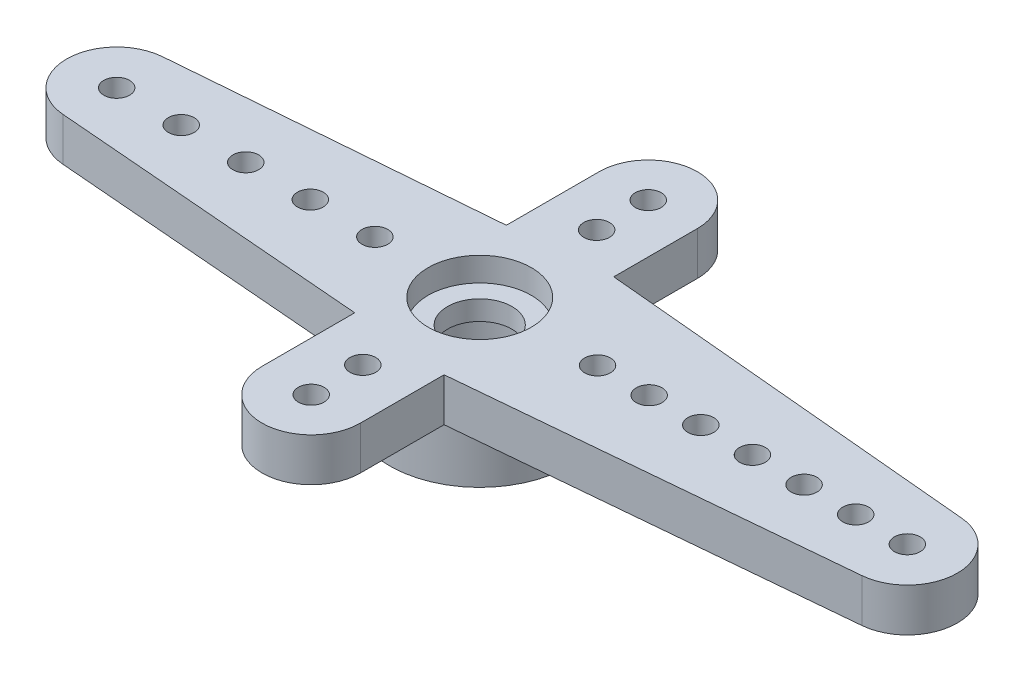
ISO-10303-21;
HEADER;
FILE_DESCRIPTION(('STEP AP214'),'2;1');
FILE_NAME('part.step','',(''),(''),'','','');
FILE_SCHEMA(('AUTOMOTIVE_DESIGN { 1 0 10303 214 1 1 1 1 }'));
ENDSEC;
DATA;
#1=APPLICATION_CONTEXT('core data for automotive mechanical design processes');
#2=APPLICATION_PROTOCOL_DEFINITION('international standard','automotive_design',2000,#1);
#3=PRODUCT_CONTEXT('',#1,'mechanical');
#4=PRODUCT('Part','Part','',(#3));
#5=PRODUCT_RELATED_PRODUCT_CATEGORY('part','',(#4));
#6=PRODUCT_DEFINITION_FORMATION('','',#4);
#7=PRODUCT_DEFINITION_CONTEXT('part definition',#1,'design');
#8=PRODUCT_DEFINITION('design','',#6,#7);
#9=PRODUCT_DEFINITION_SHAPE('','',#8);
#10=(LENGTH_UNIT() NAMED_UNIT(*) SI_UNIT(.MILLI.,.METRE.));
#11=(NAMED_UNIT(*) PLANE_ANGLE_UNIT() SI_UNIT($,.RADIAN.));
#12=(NAMED_UNIT(*) SI_UNIT($,.STERADIAN.) SOLID_ANGLE_UNIT());
#13=UNCERTAINTY_MEASURE_WITH_UNIT(LENGTH_MEASURE(1.E-05),#10,'distance_accuracy_value','');
#14=(GEOMETRIC_REPRESENTATION_CONTEXT(3) GLOBAL_UNCERTAINTY_ASSIGNED_CONTEXT((#13)) GLOBAL_UNIT_ASSIGNED_CONTEXT((#10,
#11,#12)) REPRESENTATION_CONTEXT('',''));
#15=CARTESIAN_POINT('',(0.,0.,0.));
#16=DIRECTION('',(0.,0.,1.));
#17=DIRECTION('',(1.,0.,0.));
#18=AXIS2_PLACEMENT_3D('',#15,#16,#17);
#19=CARTESIAN_POINT('',(0.,0.,0.));
#20=DIRECTION('',(0.,1.,0.));
#21=DIRECTION('',(-1.,0.,0.));
#22=AXIS2_PLACEMENT_3D('',#19,#20,#21);
#23=CYLINDRICAL_SURFACE('',#22,3.5);
#24=CARTESIAN_POINT('',(0.,-2.21,0.));
#25=DIRECTION('',(0.,1.,0.));
#26=DIRECTION('',(-1.,0.,0.));
#27=AXIS2_PLACEMENT_3D('',#24,#25,#26);
#28=CIRCLE('',#27,3.5);
#29=CARTESIAN_POINT('',(-3.5,-2.21,0.));
#30=VERTEX_POINT('',#29);
#31=EDGE_CURVE('E41',#30,#30,#28,.T.);
#32=ORIENTED_EDGE('',*,*,#31,.T.);
#33=EDGE_LOOP('',(#32));
#34=FACE_BOUND('',#33,.T.);
#35=CARTESIAN_POINT('',(0.,0.0149999999999994,0.));
#36=DIRECTION('',(0.,-1.,0.));
#37=DIRECTION('',(1.,0.,0.));
#38=AXIS2_PLACEMENT_3D('',#35,#36,#37);
#39=CIRCLE('',#38,3.5);
#40=CARTESIAN_POINT('',(-1.905,0.0149999999999992,-2.93614968964459));
#41=VERTEX_POINT('',#40);
#42=CARTESIAN_POINT('',(-1.905,0.0149999999999992,2.93614968964459));
#43=VERTEX_POINT('',#42);
#44=EDGE_CURVE('E290',#41,#43,#39,.T.);
#45=ORIENTED_EDGE('',*,*,#44,.T.);
#46=CARTESIAN_POINT('',(0.,0.0149999999999994,0.));
#47=DIRECTION('',(0.,1.,0.));
#48=DIRECTION('',(1.,0.,0.));
#49=AXIS2_PLACEMENT_3D('',#46,#47,#48);
#50=CIRCLE('',#49,3.5);
#51=EDGE_CURVE('E156',#41,#43,#50,.T.);
#52=ORIENTED_EDGE('',*,*,#51,.F.);
#53=EDGE_LOOP('',(#45,#52));
#54=FACE_BOUND('',#53,.T.);
#55=ADVANCED_FACE('F33',(#34,#54),#23,.T.);
#56=CARTESIAN_POINT('',(0.,0.,0.));
#57=DIRECTION('',(0.,1.,0.));
#58=DIRECTION('',(-1.,0.,0.));
#59=AXIS2_PLACEMENT_3D('',#56,#57,#58);
#60=CYLINDRICAL_SURFACE('',#59,2.25);
#61=CARTESIAN_POINT('',(0.,-2.21,0.));
#62=DIRECTION('',(0.,1.,0.));
#63=DIRECTION('',(-1.,0.,0.));
#64=AXIS2_PLACEMENT_3D('',#61,#62,#63);
#65=CIRCLE('',#64,2.25);
#66=CARTESIAN_POINT('',(-2.25,-2.21,0.));
#67=VERTEX_POINT('',#66);
#68=EDGE_CURVE('E11',#67,#67,#65,.T.);
#69=ORIENTED_EDGE('',*,*,#68,.F.);
#70=EDGE_LOOP('',(#69));
#71=FACE_BOUND('',#70,.T.);
#72=CARTESIAN_POINT('',(0.,0.,0.));
#73=DIRECTION('',(0.,1.,0.));
#74=DIRECTION('',(-1.,0.,0.));
#75=AXIS2_PLACEMENT_3D('',#72,#73,#74);
#76=CIRCLE('',#75,2.25);
#77=CARTESIAN_POINT('',(-2.25,0.,0.));
#78=VERTEX_POINT('',#77);
#79=EDGE_CURVE('E298',#78,#78,#76,.T.);
#80=ORIENTED_EDGE('',*,*,#79,.T.);
#81=EDGE_LOOP('',(#80));
#82=FACE_BOUND('',#81,.T.);
#83=ADVANCED_FACE('F35',(#71,#82),#60,.F.);
#84=CARTESIAN_POINT('',(3.5,-2.21,0.));
#85=DIRECTION('',(0.,1.,0.));
#86=DIRECTION('',(-1.,0.,0.));
#87=AXIS2_PLACEMENT_3D('',#84,#85,#86);
#88=PLANE('',#87);
#89=ORIENTED_EDGE('',*,*,#31,.F.);
#90=EDGE_LOOP('',(#89));
#91=FACE_BOUND('',#90,.T.);
#92=ORIENTED_EDGE('',*,*,#68,.T.);
#93=EDGE_LOOP('',(#92));
#94=FACE_BOUND('',#93,.T.);
#95=ADVANCED_FACE('F320',(#91,#94),#88,.F.);
#96=CARTESIAN_POINT('',(2.,1.69,0.));
#97=DIRECTION('',(0.,-1.,0.));
#98=DIRECTION('',(1.,0.,0.));
#99=AXIS2_PLACEMENT_3D('',#96,#97,#98);
#100=PLANE('',#99);
#101=DIRECTION('',(-0.995847060416603,0.,-0.0910419258342595));
#102=VECTOR('',#101,1.);
#103=CARTESIAN_POINT('',(0.927024810886958,1.69,-3.375));
#104=LINE('',#103,#102);
#105=CARTESIAN_POINT('',(16.7388936749485,1.69,-1.92945374129969));
#106=VERTEX_POINT('',#105);
#107=CARTESIAN_POINT('',(1.905,1.69,-3.2855919491315));
#108=VERTEX_POINT('',#107);
#109=EDGE_CURVE('E187',#106,#108,#104,.T.);
#110=ORIENTED_EDGE('',*,*,#109,.T.);
#111=DIRECTION('',(0.,0.,-1.));
#112=VECTOR('',#111,1.);
#113=CARTESIAN_POINT('',(1.905,1.69,-6.5278));
#114=LINE('',#113,#112);
#115=CARTESIAN_POINT('',(1.905,1.69,-6.5278));
#116=VERTEX_POINT('',#115);
#117=EDGE_CURVE('E71',#108,#116,#114,.T.);
#118=ORIENTED_EDGE('',*,*,#117,.T.);
#119=CARTESIAN_POINT('',(0.,1.69,-6.5278));
#120=DIRECTION('',(0.,1.,0.));
#121=DIRECTION('',(1.,0.,0.));
#122=AXIS2_PLACEMENT_3D('',#119,#120,#121);
#123=CIRCLE('',#122,1.905);
#124=CARTESIAN_POINT('',(-1.905,1.69,-6.5278));
#125=VERTEX_POINT('',#124);
#126=EDGE_CURVE('E282',#116,#125,#123,.T.);
#127=ORIENTED_EDGE('',*,*,#126,.T.);
#128=DIRECTION('',(0.,0.,1.));
#129=VECTOR('',#128,1.);
#130=CARTESIAN_POINT('',(-1.905,1.69,-6.5278));
#131=LINE('',#130,#129);
#132=CARTESIAN_POINT('',(-1.905,1.69,-2.93614968964459));
#133=VERTEX_POINT('',#132);
#134=EDGE_CURVE('E48',#125,#133,#131,.T.);
#135=ORIENTED_EDGE('',*,*,#134,.T.);
#136=DIRECTION('',(-0.996686218770202,0.,0.0813423709610028));
#137=VECTOR('',#136,1.);
#138=CARTESIAN_POINT('',(-14.2201007867802,1.69,-1.93107961066181));
#139=LINE('',#138,#137);
#140=CARTESIAN_POINT('',(-14.2201007867802,1.69,-1.93107961066181));
#141=VERTEX_POINT('',#140);
#142=EDGE_CURVE('E386',#133,#141,#139,.T.);
#143=ORIENTED_EDGE('',*,*,#142,.T.);
#144=CARTESIAN_POINT('',(-14.062499938,1.69,0.));
#145=DIRECTION('',(0.,-1.,0.));
#146=DIRECTION('',(1.,0.,0.));
#147=AXIS2_PLACEMENT_3D('',#144,#145,#146);
#148=CIRCLE('',#147,1.937500062);
#149=CARTESIAN_POINT('',(-14.2201007867802,1.69,1.93107961066181));
#150=VERTEX_POINT('',#149);
#151=EDGE_CURVE('E163',#141,#150,#148,.F.);
#152=ORIENTED_EDGE('',*,*,#151,.T.);
#153=DIRECTION('',(0.996686218770202,0.,0.0813423709610028));
#154=VECTOR('',#153,1.);
#155=CARTESIAN_POINT('',(-1.905,1.69,2.93614968964459));
#156=LINE('',#155,#154);
#157=CARTESIAN_POINT('',(-1.905,1.69,2.93614968964459));
#158=VERTEX_POINT('',#157);
#159=EDGE_CURVE('E141',#150,#158,#156,.T.);
#160=ORIENTED_EDGE('',*,*,#159,.T.);
#161=DIRECTION('',(0.,0.,1.));
#162=VECTOR('',#161,1.);
#163=CARTESIAN_POINT('',(-1.905,1.69,6.5278));
#164=LINE('',#163,#162);
#165=CARTESIAN_POINT('',(-1.905,1.69,6.5278));
#166=VERTEX_POINT('',#165);
#167=EDGE_CURVE('E253',#158,#166,#164,.T.);
#168=ORIENTED_EDGE('',*,*,#167,.T.);
#169=CARTESIAN_POINT('',(0.,1.69,6.5278));
#170=DIRECTION('',(0.,1.,0.));
#171=DIRECTION('',(-1.,0.,0.));
#172=AXIS2_PLACEMENT_3D('',#169,#170,#171);
#173=CIRCLE('',#172,1.905);
#174=CARTESIAN_POINT('',(1.905,1.69,6.5278));
#175=VERTEX_POINT('',#174);
#176=EDGE_CURVE('E246',#166,#175,#173,.T.);
#177=ORIENTED_EDGE('',*,*,#176,.T.);
#178=DIRECTION('',(0.,0.,-1.));
#179=VECTOR('',#178,1.);
#180=CARTESIAN_POINT('',(1.905,1.69,6.5278));
#181=LINE('',#180,#179);
#182=CARTESIAN_POINT('',(1.905,1.69,3.2855919491315));
#183=VERTEX_POINT('',#182);
#184=EDGE_CURVE('E262',#175,#183,#181,.T.);
#185=ORIENTED_EDGE('',*,*,#184,.T.);
#186=DIRECTION('',(0.995847060416603,0.,-0.0910419258342595));
#187=VECTOR('',#186,1.);
#188=CARTESIAN_POINT('',(0.927024810886958,1.69,3.375));
#189=LINE('',#188,#187);
#190=CARTESIAN_POINT('',(16.7388936749485,1.69,1.92945374129969));
#191=VERTEX_POINT('',#190);
#192=EDGE_CURVE('E192',#183,#191,#189,.T.);
#193=ORIENTED_EDGE('',*,*,#192,.T.);
#194=CARTESIAN_POINT('',(16.562499938,1.69,0.));
#195=DIRECTION('',(0.,-1.,0.));
#196=DIRECTION('',(1.,0.,0.));
#197=AXIS2_PLACEMENT_3D('',#194,#195,#196);
#198=CIRCLE('',#197,1.937500062);
#199=EDGE_CURVE('E193',#191,#106,#198,.F.);
#200=ORIENTED_EDGE('',*,*,#199,.T.);
#201=EDGE_LOOP('',(#110,#118,#127,#135,#143,#152,#160,#168,#177,#185,#193,#200));
#202=FACE_BOUND('',#201,.T.);
#203=CARTESIAN_POINT('',(14.562499938,1.69,0.));
#204=DIRECTION('',(0.,-1.,0.));
#205=DIRECTION('',(1.,0.,0.));
#206=AXIS2_PLACEMENT_3D('',#203,#204,#205);
#207=CIRCLE('',#206,0.499999999999999);
#208=CARTESIAN_POINT('',(15.062499938,1.69,0.));
#209=VERTEX_POINT('',#208);
#210=EDGE_CURVE('E181',#209,#209,#207,.F.);
#211=ORIENTED_EDGE('',*,*,#210,.F.);
#212=EDGE_LOOP('',(#211));
#213=FACE_BOUND('',#212,.T.);
#214=CARTESIAN_POINT('',(10.562499938,1.69,0.));
#215=DIRECTION('',(0.,-1.,0.));
#216=DIRECTION('',(1.,0.,0.));
#217=AXIS2_PLACEMENT_3D('',#214,#215,#216);
#218=CIRCLE('',#217,0.499999999999999);
#219=CARTESIAN_POINT('',(11.062499938,1.69,0.));
#220=VERTEX_POINT('',#219);
#221=EDGE_CURVE('E174',#220,#220,#218,.F.);
#222=ORIENTED_EDGE('',*,*,#221,.F.);
#223=EDGE_LOOP('',(#222));
#224=FACE_BOUND('',#223,.T.);
#225=CARTESIAN_POINT('',(6.562499938,1.69,0.));
#226=DIRECTION('',(0.,-1.,0.));
#227=DIRECTION('',(1.,0.,0.));
#228=AXIS2_PLACEMENT_3D('',#225,#226,#227);
#229=CIRCLE('',#228,0.499999999999999);
#230=CARTESIAN_POINT('',(7.062499938,1.69,0.));
#231=VERTEX_POINT('',#230);
#232=EDGE_CURVE('E170',#231,#231,#229,.F.);
#233=ORIENTED_EDGE('',*,*,#232,.F.);
#234=EDGE_LOOP('',(#233));
#235=FACE_BOUND('',#234,.T.);
#236=CARTESIAN_POINT('',(4.562499938,1.69,0.));
#237=DIRECTION('',(0.,-1.,0.));
#238=DIRECTION('',(1.,0.,0.));
#239=AXIS2_PLACEMENT_3D('',#236,#237,#238);
#240=CIRCLE('',#239,0.499999999999999);
#241=CARTESIAN_POINT('',(5.062499938,1.69,0.));
#242=VERTEX_POINT('',#241);
#243=EDGE_CURVE('E173',#242,#242,#240,.F.);
#244=ORIENTED_EDGE('',*,*,#243,.F.);
#245=EDGE_LOOP('',(#244));
#246=FACE_BOUND('',#245,.T.);
#247=CARTESIAN_POINT('',(8.562499938,1.69,0.));
#248=DIRECTION('',(0.,-1.,0.));
#249=DIRECTION('',(1.,0.,0.));
#250=AXIS2_PLACEMENT_3D('',#247,#248,#249);
#251=CIRCLE('',#250,0.499999999999999);
#252=CARTESIAN_POINT('',(9.062499938,1.69,0.));
#253=VERTEX_POINT('',#252);
#254=EDGE_CURVE('E175',#253,#253,#251,.F.);
#255=ORIENTED_EDGE('',*,*,#254,.F.);
#256=EDGE_LOOP('',(#255));
#257=FACE_BOUND('',#256,.T.);
#258=CARTESIAN_POINT('',(12.562499938,1.69,0.));
#259=DIRECTION('',(0.,-1.,0.));
#260=DIRECTION('',(1.,0.,0.));
#261=AXIS2_PLACEMENT_3D('',#258,#259,#260);
#262=CIRCLE('',#261,0.499999999999999);
#263=CARTESIAN_POINT('',(13.062499938,1.69,0.));
#264=VERTEX_POINT('',#263);
#265=EDGE_CURVE('E178',#264,#264,#262,.F.);
#266=ORIENTED_EDGE('',*,*,#265,.F.);
#267=EDGE_LOOP('',(#266));
#268=FACE_BOUND('',#267,.T.);
#269=CARTESIAN_POINT('',(16.562499938,1.69,0.));
#270=DIRECTION('',(0.,-1.,0.));
#271=DIRECTION('',(1.,0.,0.));
#272=AXIS2_PLACEMENT_3D('',#269,#270,#271);
#273=CIRCLE('',#272,0.499999999999999);
#274=CARTESIAN_POINT('',(17.062499938,1.69,0.));
#275=VERTEX_POINT('',#274);
#276=EDGE_CURVE('E184',#275,#275,#273,.F.);
#277=ORIENTED_EDGE('',*,*,#276,.F.);
#278=EDGE_LOOP('',(#277));
#279=FACE_BOUND('',#278,.T.);
#280=CARTESIAN_POINT('',(0.,1.69,0.));
#281=DIRECTION('',(0.,1.,0.));
#282=DIRECTION('',(-1.,0.,0.));
#283=AXIS2_PLACEMENT_3D('',#280,#281,#282);
#284=CIRCLE('',#283,2.);
#285=CARTESIAN_POINT('',(-2.,1.69,0.));
#286=VERTEX_POINT('',#285);
#287=EDGE_CURVE('E313',#286,#286,#284,.T.);
#288=ORIENTED_EDGE('',*,*,#287,.F.);
#289=EDGE_LOOP('',(#288));
#290=FACE_BOUND('',#289,.T.);
#291=CARTESIAN_POINT('',(0.,1.69,-4.5278));
#292=DIRECTION('',(0.,1.,0.));
#293=DIRECTION('',(-1.,0.,0.));
#294=AXIS2_PLACEMENT_3D('',#291,#292,#293);
#295=CIRCLE('',#294,0.5);
#296=CARTESIAN_POINT('',(-0.5,1.69,-4.5278));
#297=VERTEX_POINT('',#296);
#298=EDGE_CURVE('E269',#297,#297,#295,.T.);
#299=ORIENTED_EDGE('',*,*,#298,.F.);
#300=EDGE_LOOP('',(#299));
#301=FACE_BOUND('',#300,.T.);
#302=CARTESIAN_POINT('',(0.,1.69,-6.5278));
#303=DIRECTION('',(0.,1.,0.));
#304=DIRECTION('',(-1.,0.,0.));
#305=AXIS2_PLACEMENT_3D('',#302,#303,#304);
#306=CIRCLE('',#305,0.5);
#307=CARTESIAN_POINT('',(-0.500000000000001,1.69,-6.5278));
#308=VERTEX_POINT('',#307);
#309=EDGE_CURVE('E276',#308,#308,#306,.T.);
#310=ORIENTED_EDGE('',*,*,#309,.F.);
#311=EDGE_LOOP('',(#310));
#312=FACE_BOUND('',#311,.T.);
#313=CARTESIAN_POINT('',(0.,1.69,4.5278));
#314=DIRECTION('',(0.,1.,0.));
#315=DIRECTION('',(1.,0.,0.));
#316=AXIS2_PLACEMENT_3D('',#313,#314,#315);
#317=CIRCLE('',#316,0.5);
#318=CARTESIAN_POINT('',(0.5,1.69,4.5278));
#319=VERTEX_POINT('',#318);
#320=EDGE_CURVE('E236',#319,#319,#317,.T.);
#321=ORIENTED_EDGE('',*,*,#320,.F.);
#322=EDGE_LOOP('',(#321));
#323=FACE_BOUND('',#322,.T.);
#324=CARTESIAN_POINT('',(0.,1.69,6.5278));
#325=DIRECTION('',(0.,1.,0.));
#326=DIRECTION('',(1.,0.,0.));
#327=AXIS2_PLACEMENT_3D('',#324,#325,#326);
#328=CIRCLE('',#327,0.5);
#329=CARTESIAN_POINT('',(0.500000000000001,1.69,6.5278));
#330=VERTEX_POINT('',#329);
#331=EDGE_CURVE('E240',#330,#330,#328,.T.);
#332=ORIENTED_EDGE('',*,*,#331,.F.);
#333=EDGE_LOOP('',(#332));
#334=FACE_BOUND('',#333,.T.);
#335=CARTESIAN_POINT('',(-11.562499938,1.69,0.));
#336=DIRECTION('',(0.,-1.,0.));
#337=DIRECTION('',(1.,0.,0.));
#338=AXIS2_PLACEMENT_3D('',#335,#336,#337);
#339=CIRCLE('',#338,0.499999999999999);
#340=CARTESIAN_POINT('',(-11.062499938,1.69,0.));
#341=VERTEX_POINT('',#340);
#342=EDGE_CURVE('E369',#341,#341,#339,.F.);
#343=ORIENTED_EDGE('',*,*,#342,.F.);
#344=EDGE_LOOP('',(#343));
#345=FACE_BOUND('',#344,.T.);
#346=CARTESIAN_POINT('',(-6.562499938,1.69,0.));
#347=DIRECTION('',(0.,-1.,0.));
#348=DIRECTION('',(1.,0.,0.));
#349=AXIS2_PLACEMENT_3D('',#346,#347,#348);
#350=CIRCLE('',#349,0.499999999999999);
#351=CARTESIAN_POINT('',(-6.062499938,1.69,0.));
#352=VERTEX_POINT('',#351);
#353=EDGE_CURVE('E169',#352,#352,#350,.F.);
#354=ORIENTED_EDGE('',*,*,#353,.F.);
#355=EDGE_LOOP('',(#354));
#356=FACE_BOUND('',#355,.T.);
#357=CARTESIAN_POINT('',(-4.062499938,1.69,0.));
#358=DIRECTION('',(0.,-1.,0.));
#359=DIRECTION('',(1.,0.,0.));
#360=AXIS2_PLACEMENT_3D('',#357,#358,#359);
#361=CIRCLE('',#360,0.499999999999999);
#362=CARTESIAN_POINT('',(-3.562499938,1.69,0.));
#363=VERTEX_POINT('',#362);
#364=EDGE_CURVE('E165',#363,#363,#361,.F.);
#365=ORIENTED_EDGE('',*,*,#364,.F.);
#366=EDGE_LOOP('',(#365));
#367=FACE_BOUND('',#366,.T.);
#368=CARTESIAN_POINT('',(-9.062499938,1.69,0.));
#369=DIRECTION('',(0.,-1.,0.));
#370=DIRECTION('',(1.,0.,0.));
#371=AXIS2_PLACEMENT_3D('',#368,#369,#370);
#372=CIRCLE('',#371,0.499999999999999);
#373=CARTESIAN_POINT('',(-8.562499938,1.69,0.));
#374=VERTEX_POINT('',#373);
#375=EDGE_CURVE('E168',#374,#374,#372,.F.);
#376=ORIENTED_EDGE('',*,*,#375,.F.);
#377=EDGE_LOOP('',(#376));
#378=FACE_BOUND('',#377,.T.);
#379=CARTESIAN_POINT('',(-14.062499938,1.69,0.));
#380=DIRECTION('',(0.,-1.,0.));
#381=DIRECTION('',(1.,0.,0.));
#382=AXIS2_PLACEMENT_3D('',#379,#380,#381);
#383=CIRCLE('',#382,0.499999999999999);
#384=CARTESIAN_POINT('',(-13.562499938,1.69,0.));
#385=VERTEX_POINT('',#384);
#386=EDGE_CURVE('E201',#385,#385,#383,.F.);
#387=ORIENTED_EDGE('',*,*,#386,.F.);
#388=EDGE_LOOP('',(#387));
#389=FACE_BOUND('',#388,.T.);
#390=ADVANCED_FACE('F323',(#202,#213,#224,#235,#246,#257,#268,#279,#290,#301,#312,#323,#334,
#345,#356,#367,#378,#389),#100,.F.);
#391=CARTESIAN_POINT('',(0.,0.,0.));
#392=DIRECTION('',(0.,1.,0.));
#393=DIRECTION('',(-1.,0.,0.));
#394=AXIS2_PLACEMENT_3D('',#391,#392,#393);
#395=CYLINDRICAL_SURFACE('',#394,2.);
#396=CARTESIAN_POINT('',(0.,0.759999999999999,0.));
#397=DIRECTION('',(0.,1.,0.));
#398=DIRECTION('',(-1.,0.,0.));
#399=AXIS2_PLACEMENT_3D('',#396,#397,#398);
#400=CIRCLE('',#399,2.);
#401=CARTESIAN_POINT('',(-2.,0.759999999999999,0.));
#402=VERTEX_POINT('',#401);
#403=EDGE_CURVE('E310',#402,#402,#400,.T.);
#404=ORIENTED_EDGE('',*,*,#403,.F.);
#405=EDGE_LOOP('',(#404));
#406=FACE_BOUND('',#405,.T.);
#407=ORIENTED_EDGE('',*,*,#287,.T.);
#408=EDGE_LOOP('',(#407));
#409=FACE_BOUND('',#408,.T.);
#410=ADVANCED_FACE('F346',(#406,#409),#395,.F.);
#411=CARTESIAN_POINT('',(1.25,0.76,0.));
#412=DIRECTION('',(0.,-1.,0.));
#413=DIRECTION('',(1.,0.,0.));
#414=AXIS2_PLACEMENT_3D('',#411,#412,#413);
#415=PLANE('',#414);
#416=CARTESIAN_POINT('',(0.,0.759999999999999,0.));
#417=DIRECTION('',(0.,1.,0.));
#418=DIRECTION('',(-1.,0.,0.));
#419=AXIS2_PLACEMENT_3D('',#416,#417,#418);
#420=CIRCLE('',#419,1.25);
#421=CARTESIAN_POINT('',(-1.25,0.759999999999999,0.));
#422=VERTEX_POINT('',#421);
#423=EDGE_CURVE('E307',#422,#422,#420,.T.);
#424=ORIENTED_EDGE('',*,*,#423,.F.);
#425=EDGE_LOOP('',(#424));
#426=FACE_BOUND('',#425,.T.);
#427=ORIENTED_EDGE('',*,*,#403,.T.);
#428=EDGE_LOOP('',(#427));
#429=FACE_BOUND('',#428,.T.);
#430=ADVANCED_FACE('F340',(#426,#429),#415,.F.);
#431=CARTESIAN_POINT('',(0.,0.,0.));
#432=DIRECTION('',(0.,1.,0.));
#433=DIRECTION('',(-1.,0.,0.));
#434=AXIS2_PLACEMENT_3D('',#431,#432,#433);
#435=CYLINDRICAL_SURFACE('',#434,1.25);
#436=CARTESIAN_POINT('',(0.,0.,0.));
#437=DIRECTION('',(0.,1.,0.));
#438=DIRECTION('',(-1.,0.,0.));
#439=AXIS2_PLACEMENT_3D('',#436,#437,#438);
#440=CIRCLE('',#439,1.25);
#441=CARTESIAN_POINT('',(-1.25,0.,0.));
#442=VERTEX_POINT('',#441);
#443=EDGE_CURVE('E304',#442,#442,#440,.T.);
#444=ORIENTED_EDGE('',*,*,#443,.F.);
#445=EDGE_LOOP('',(#444));
#446=FACE_BOUND('',#445,.T.);
#447=ORIENTED_EDGE('',*,*,#423,.T.);
#448=EDGE_LOOP('',(#447));
#449=FACE_BOUND('',#448,.T.);
#450=ADVANCED_FACE('F334',(#446,#449),#435,.F.);
#451=CARTESIAN_POINT('',(2.25,0.,0.));
#452=DIRECTION('',(0.,1.,0.));
#453=DIRECTION('',(-1.,0.,0.));
#454=AXIS2_PLACEMENT_3D('',#451,#452,#453);
#455=PLANE('',#454);
#456=ORIENTED_EDGE('',*,*,#79,.F.);
#457=EDGE_LOOP('',(#456));
#458=FACE_BOUND('',#457,.T.);
#459=ORIENTED_EDGE('',*,*,#443,.T.);
#460=EDGE_LOOP('',(#459));
#461=FACE_BOUND('',#460,.T.);
#462=ADVANCED_FACE('F330',(#458,#461),#455,.F.);
#463=CARTESIAN_POINT('',(0.,0.0149999999999994,-6.5278));
#464=DIRECTION('',(0.,1.,0.));
#465=DIRECTION('',(-1.,0.,0.));
#466=AXIS2_PLACEMENT_3D('',#463,#464,#465);
#467=CYLINDRICAL_SURFACE('',#466,1.905);
#468=ORIENTED_EDGE('',*,*,#126,.F.);
#469=DIRECTION('',(0.,1.,0.));
#470=VECTOR('',#469,1.);
#471=CARTESIAN_POINT('',(1.905,0.0149999999999996,-6.5278));
#472=LINE('',#471,#470);
#473=CARTESIAN_POINT('',(1.905,0.0149999999999996,-6.5278));
#474=VERTEX_POINT('',#473);
#475=EDGE_CURVE('E296',#474,#116,#472,.T.);
#476=ORIENTED_EDGE('',*,*,#475,.F.);
#477=CARTESIAN_POINT('',(0.,0.0149999999999994,-6.5278));
#478=DIRECTION('',(0.,1.,0.));
#479=DIRECTION('',(1.,0.,0.));
#480=AXIS2_PLACEMENT_3D('',#477,#478,#479);
#481=CIRCLE('',#480,1.905);
#482=CARTESIAN_POINT('',(-1.905,0.0149999999999992,-6.5278));
#483=VERTEX_POINT('',#482);
#484=EDGE_CURVE('E285',#474,#483,#481,.T.);
#485=ORIENTED_EDGE('',*,*,#484,.T.);
#486=DIRECTION('',(0.,1.,0.));
#487=VECTOR('',#486,1.);
#488=CARTESIAN_POINT('',(-1.905,0.0149999999999992,-6.5278));
#489=LINE('',#488,#487);
#490=EDGE_CURVE('E75',#483,#125,#489,.T.);
#491=ORIENTED_EDGE('',*,*,#490,.T.);
#492=EDGE_LOOP('',(#468,#476,#485,#491));
#493=FACE_BOUND('',#492,.T.);
#494=ADVANCED_FACE('F333',(#493),#467,.T.);
#495=CARTESIAN_POINT('',(1.905,0.0149999999999996,-6.5278));
#496=DIRECTION('',(1.,0.,0.));
#497=DIRECTION('',(0.,0.,-1.));
#498=AXIS2_PLACEMENT_3D('',#495,#496,#497);
#499=PLANE('',#498);
#500=DIRECTION('',(0.,1.,0.));
#501=VECTOR('',#500,1.);
#502=CARTESIAN_POINT('',(1.905,0.0149999999999996,-3.2855919491315));
#503=LINE('',#502,#501);
#504=CARTESIAN_POINT('',(1.905,0.0149999999999996,-3.2855919491315));
#505=VERTEX_POINT('',#504);
#506=EDGE_CURVE('E234',#505,#108,#503,.T.);
#507=ORIENTED_EDGE('',*,*,#506,.F.);
#508=DIRECTION('',(0.,0.,-1.));
#509=VECTOR('',#508,1.);
#510=CARTESIAN_POINT('',(1.905,0.0149999999999996,-6.5278));
#511=LINE('',#510,#509);
#512=EDGE_CURVE('E57',#505,#474,#511,.T.);
#513=ORIENTED_EDGE('',*,*,#512,.T.);
#514=ORIENTED_EDGE('',*,*,#475,.T.);
#515=ORIENTED_EDGE('',*,*,#117,.F.);
#516=EDGE_LOOP('',(#507,#513,#514,#515));
#517=FACE_BOUND('',#516,.T.);
#518=ADVANCED_FACE('F430',(#517),#499,.T.);
#519=CARTESIAN_POINT('',(-1.905,0.0149999999999992,-6.5278));
#520=DIRECTION('',(-1.,0.,0.));
#521=DIRECTION('',(0.,-1.,0.));
#522=AXIS2_PLACEMENT_3D('',#519,#520,#521);
#523=PLANE('',#522);
#524=ORIENTED_EDGE('',*,*,#134,.F.);
#525=ORIENTED_EDGE('',*,*,#490,.F.);
#526=DIRECTION('',(0.,0.,1.));
#527=VECTOR('',#526,1.);
#528=CARTESIAN_POINT('',(-1.905,0.0149999999999992,-6.5278));
#529=LINE('',#528,#527);
#530=EDGE_CURVE('E288',#483,#41,#529,.T.);
#531=ORIENTED_EDGE('',*,*,#530,.T.);
#532=DIRECTION('',(0.,1.,0.));
#533=VECTOR('',#532,1.);
#534=CARTESIAN_POINT('',(-1.905,0.0149999999999992,-2.93614968964459));
#535=LINE('',#534,#533);
#536=EDGE_CURVE('E299',#41,#133,#535,.T.);
#537=ORIENTED_EDGE('',*,*,#536,.T.);
#538=EDGE_LOOP('',(#524,#525,#531,#537));
#539=FACE_BOUND('',#538,.T.);
#540=ADVANCED_FACE('F432',(#539),#523,.T.);
#541=CARTESIAN_POINT('',(0.,0.0149999999999994,-6.5278));
#542=DIRECTION('',(0.,-1.,0.));
#543=DIRECTION('',(1.,0.,0.));
#544=AXIS2_PLACEMENT_3D('',#541,#542,#543);
#545=PLANE('',#544);
#546=ORIENTED_EDGE('',*,*,#512,.F.);
#547=DIRECTION('',(0.995847060416603,0.,0.0910419258342595));
#548=VECTOR('',#547,1.);
#549=CARTESIAN_POINT('',(0.927024810886958,0.0149999999999995,-3.375));
#550=LINE('',#549,#548);
#551=CARTESIAN_POINT('',(16.7388936749485,0.0150000000000014,-1.92945374129969));
#552=VERTEX_POINT('',#551);
#553=EDGE_CURVE('E219',#505,#552,#550,.T.);
#554=ORIENTED_EDGE('',*,*,#553,.T.);
#555=CARTESIAN_POINT('',(16.562499938,0.0150000000000014,0.));
#556=DIRECTION('',(0.,-1.,0.));
#557=DIRECTION('',(-1.,0.,0.));
#558=AXIS2_PLACEMENT_3D('',#555,#556,#557);
#559=CIRCLE('',#558,1.937500062);
#560=CARTESIAN_POINT('',(16.7388936749485,0.0150000000000014,1.92945374129969));
#561=VERTEX_POINT('',#560);
#562=EDGE_CURVE('E221',#552,#561,#559,.T.);
#563=ORIENTED_EDGE('',*,*,#562,.T.);
#564=DIRECTION('',(-0.995847060416603,0.,0.0910419258342595));
#565=VECTOR('',#564,1.);
#566=CARTESIAN_POINT('',(0.927024810886958,0.0149999999999995,3.375));
#567=LINE('',#566,#565);
#568=CARTESIAN_POINT('',(1.905,0.0149999999999996,3.2855919491315));
#569=VERTEX_POINT('',#568);
#570=EDGE_CURVE('E224',#561,#569,#567,.T.);
#571=ORIENTED_EDGE('',*,*,#570,.T.);
#572=DIRECTION('',(0.,0.,-1.));
#573=VECTOR('',#572,1.);
#574=CARTESIAN_POINT('',(1.905,0.0149999999999996,6.5278));
#575=LINE('',#574,#573);
#576=CARTESIAN_POINT('',(1.905,0.0149999999999996,6.5278));
#577=VERTEX_POINT('',#576);
#578=EDGE_CURVE('E252',#577,#569,#575,.T.);
#579=ORIENTED_EDGE('',*,*,#578,.F.);
#580=CARTESIAN_POINT('',(0.,0.0149999999999994,6.5278));
#581=DIRECTION('',(0.,1.,0.));
#582=DIRECTION('',(-1.,0.,0.));
#583=AXIS2_PLACEMENT_3D('',#580,#581,#582);
#584=CIRCLE('',#583,1.905);
#585=CARTESIAN_POINT('',(-1.905,0.0149999999999992,6.5278));
#586=VERTEX_POINT('',#585);
#587=EDGE_CURVE('E249',#586,#577,#584,.T.);
#588=ORIENTED_EDGE('',*,*,#587,.F.);
#589=DIRECTION('',(0.,0.,1.));
#590=VECTOR('',#589,1.);
#591=CARTESIAN_POINT('',(-1.905,0.0149999999999992,6.5278));
#592=LINE('',#591,#590);
#593=EDGE_CURVE('E256',#43,#586,#592,.T.);
#594=ORIENTED_EDGE('',*,*,#593,.F.);
#595=ORIENTED_EDGE('',*,*,#44,.F.);
#596=ORIENTED_EDGE('',*,*,#530,.F.);
#597=ORIENTED_EDGE('',*,*,#484,.F.);
#598=EDGE_LOOP('',(#546,#554,#563,#571,#579,#588,#594,#595,#596,#597));
#599=FACE_BOUND('',#598,.T.);
#600=CARTESIAN_POINT('',(0.,0.0149999999999994,-4.5278));
#601=DIRECTION('',(0.,1.,0.));
#602=DIRECTION('',(-1.,0.,0.));
#603=AXIS2_PLACEMENT_3D('',#600,#601,#602);
#604=CIRCLE('',#603,0.5);
#605=CARTESIAN_POINT('',(-0.5,0.0149999999999993,-4.5278));
#606=VERTEX_POINT('',#605);
#607=EDGE_CURVE('E273',#606,#606,#604,.T.);
#608=ORIENTED_EDGE('',*,*,#607,.T.);
#609=EDGE_LOOP('',(#608));
#610=FACE_BOUND('',#609,.T.);
#611=CARTESIAN_POINT('',(0.,0.0149999999999994,-6.5278));
#612=DIRECTION('',(0.,1.,0.));
#613=DIRECTION('',(-1.,0.,0.));
#614=AXIS2_PLACEMENT_3D('',#611,#612,#613);
#615=CIRCLE('',#614,0.5);
#616=CARTESIAN_POINT('',(-0.500000000000001,0.0149999999999993,-6.5278));
#617=VERTEX_POINT('',#616);
#618=EDGE_CURVE('E279',#617,#617,#615,.T.);
#619=ORIENTED_EDGE('',*,*,#618,.T.);
#620=EDGE_LOOP('',(#619));
#621=FACE_BOUND('',#620,.T.);
#622=CARTESIAN_POINT('',(0.,0.0149999999999994,4.5278));
#623=DIRECTION('',(0.,1.,0.));
#624=DIRECTION('',(1.,0.,0.));
#625=AXIS2_PLACEMENT_3D('',#622,#623,#624);
#626=CIRCLE('',#625,0.5);
#627=CARTESIAN_POINT('',(0.5,0.0149999999999994,4.5278));
#628=VERTEX_POINT('',#627);
#629=EDGE_CURVE('E237',#628,#628,#626,.T.);
#630=ORIENTED_EDGE('',*,*,#629,.T.);
#631=EDGE_LOOP('',(#630));
#632=FACE_BOUND('',#631,.T.);
#633=CARTESIAN_POINT('',(0.,0.0149999999999994,6.5278));
#634=DIRECTION('',(0.,1.,0.));
#635=DIRECTION('',(1.,0.,0.));
#636=AXIS2_PLACEMENT_3D('',#633,#634,#635);
#637=CIRCLE('',#636,0.5);
#638=CARTESIAN_POINT('',(0.500000000000001,0.0149999999999994,6.5278));
#639=VERTEX_POINT('',#638);
#640=EDGE_CURVE('E243',#639,#639,#637,.T.);
#641=ORIENTED_EDGE('',*,*,#640,.T.);
#642=EDGE_LOOP('',(#641));
#643=FACE_BOUND('',#642,.T.);
#644=CARTESIAN_POINT('',(4.562499938,0.0149999999999999,0.));
#645=DIRECTION('',(0.,-1.,0.));
#646=DIRECTION('',(1.,0.,0.));
#647=AXIS2_PLACEMENT_3D('',#644,#645,#646);
#648=CIRCLE('',#647,0.499999999999999);
#649=CARTESIAN_POINT('',(5.062499938,0.015,0.));
#650=VERTEX_POINT('',#649);
#651=EDGE_CURVE('E197',#650,#650,#648,.T.);
#652=ORIENTED_EDGE('',*,*,#651,.F.);
#653=EDGE_LOOP('',(#652));
#654=FACE_BOUND('',#653,.T.);
#655=CARTESIAN_POINT('',(6.562499938,0.0150000000000002,0.));
#656=DIRECTION('',(0.,-1.,0.));
#657=DIRECTION('',(1.,0.,0.));
#658=AXIS2_PLACEMENT_3D('',#655,#656,#657);
#659=CIRCLE('',#658,0.499999999999999);
#660=CARTESIAN_POINT('',(7.062499938,0.0150000000000003,0.));
#661=VERTEX_POINT('',#660);
#662=EDGE_CURVE('E200',#661,#661,#659,.T.);
#663=ORIENTED_EDGE('',*,*,#662,.F.);
#664=EDGE_LOOP('',(#663));
#665=FACE_BOUND('',#664,.T.);
#666=CARTESIAN_POINT('',(8.562499938,0.0150000000000004,0.));
#667=DIRECTION('',(0.,-1.,0.));
#668=DIRECTION('',(1.,0.,0.));
#669=AXIS2_PLACEMENT_3D('',#666,#667,#668);
#670=CIRCLE('',#669,0.499999999999999);
#671=CARTESIAN_POINT('',(9.062499938,0.0150000000000005,0.));
#672=VERTEX_POINT('',#671);
#673=EDGE_CURVE('E204',#672,#672,#670,.T.);
#674=ORIENTED_EDGE('',*,*,#673,.F.);
#675=EDGE_LOOP('',(#674));
#676=FACE_BOUND('',#675,.T.);
#677=CARTESIAN_POINT('',(10.562499938,0.0150000000000007,0.));
#678=DIRECTION('',(0.,-1.,0.));
#679=DIRECTION('',(1.,0.,0.));
#680=AXIS2_PLACEMENT_3D('',#677,#678,#679);
#681=CIRCLE('',#680,0.499999999999999);
#682=CARTESIAN_POINT('',(11.062499938,0.0150000000000007,0.));
#683=VERTEX_POINT('',#682);
#684=EDGE_CURVE('E207',#683,#683,#681,.T.);
#685=ORIENTED_EDGE('',*,*,#684,.F.);
#686=EDGE_LOOP('',(#685));
#687=FACE_BOUND('',#686,.T.);
#688=CARTESIAN_POINT('',(12.562499938,0.0150000000000009,0.));
#689=DIRECTION('',(0.,-1.,0.));
#690=DIRECTION('',(1.,0.,0.));
#691=AXIS2_PLACEMENT_3D('',#688,#689,#690);
#692=CIRCLE('',#691,0.499999999999999);
#693=CARTESIAN_POINT('',(13.062499938,0.015000000000001,0.));
#694=VERTEX_POINT('',#693);
#695=EDGE_CURVE('E210',#694,#694,#692,.T.);
#696=ORIENTED_EDGE('',*,*,#695,.F.);
#697=EDGE_LOOP('',(#696));
#698=FACE_BOUND('',#697,.T.);
#699=CARTESIAN_POINT('',(14.562499938,0.0150000000000012,0.));
#700=DIRECTION('',(0.,-1.,0.));
#701=DIRECTION('',(1.,0.,0.));
#702=AXIS2_PLACEMENT_3D('',#699,#700,#701);
#703=CIRCLE('',#702,0.499999999999999);
#704=CARTESIAN_POINT('',(15.062499938,0.0150000000000012,0.));
#705=VERTEX_POINT('',#704);
#706=EDGE_CURVE('E213',#705,#705,#703,.T.);
#707=ORIENTED_EDGE('',*,*,#706,.F.);
#708=EDGE_LOOP('',(#707));
#709=FACE_BOUND('',#708,.T.);
#710=CARTESIAN_POINT('',(16.562499938,0.0150000000000014,0.));
#711=DIRECTION('',(0.,-1.,0.));
#712=DIRECTION('',(1.,0.,0.));
#713=AXIS2_PLACEMENT_3D('',#710,#711,#712);
#714=CIRCLE('',#713,0.499999999999999);
#715=CARTESIAN_POINT('',(17.062499938,0.0150000000000015,0.));
#716=VERTEX_POINT('',#715);
#717=EDGE_CURVE('E216',#716,#716,#714,.T.);
#718=ORIENTED_EDGE('',*,*,#717,.F.);
#719=EDGE_LOOP('',(#718));
#720=FACE_BOUND('',#719,.T.);
#721=ADVANCED_FACE('F435',(#599,#610,#621,#632,#643,#654,#665,#676,#687,#698,#709,#720),#545,.T.);
#722=CARTESIAN_POINT('',(0.,0.0149999999999994,-6.5278));
#723=DIRECTION('',(0.,1.,0.));
#724=DIRECTION('',(-1.,0.,0.));
#725=AXIS2_PLACEMENT_3D('',#722,#723,#724);
#726=CYLINDRICAL_SURFACE('',#725,0.5);
#727=ORIENTED_EDGE('',*,*,#618,.F.);
#728=EDGE_LOOP('',(#727));
#729=FACE_BOUND('',#728,.T.);
#730=ORIENTED_EDGE('',*,*,#309,.T.);
#731=EDGE_LOOP('',(#730));
#732=FACE_BOUND('',#731,.T.);
#733=ADVANCED_FACE('F440',(#729,#732),#726,.F.);
#734=CARTESIAN_POINT('',(0.,0.0149999999999994,-4.5278));
#735=DIRECTION('',(0.,1.,0.));
#736=DIRECTION('',(-1.,0.,0.));
#737=AXIS2_PLACEMENT_3D('',#734,#735,#736);
#738=CYLINDRICAL_SURFACE('',#737,0.5);
#739=ORIENTED_EDGE('',*,*,#607,.F.);
#740=EDGE_LOOP('',(#739));
#741=FACE_BOUND('',#740,.T.);
#742=ORIENTED_EDGE('',*,*,#298,.T.);
#743=EDGE_LOOP('',(#742));
#744=FACE_BOUND('',#743,.T.);
#745=ADVANCED_FACE('F444',(#741,#744),#738,.F.);
#746=CARTESIAN_POINT('',(0.,0.0149999999999994,6.5278));
#747=DIRECTION('',(0.,1.,0.));
#748=DIRECTION('',(-1.,0.,0.));
#749=AXIS2_PLACEMENT_3D('',#746,#747,#748);
#750=CYLINDRICAL_SURFACE('',#749,1.905);
#751=ORIENTED_EDGE('',*,*,#176,.F.);
#752=DIRECTION('',(0.,1.,0.));
#753=VECTOR('',#752,1.);
#754=CARTESIAN_POINT('',(-1.905,0.0149999999999992,6.5278));
#755=LINE('',#754,#753);
#756=EDGE_CURVE('E267',#586,#166,#755,.T.);
#757=ORIENTED_EDGE('',*,*,#756,.F.);
#758=ORIENTED_EDGE('',*,*,#587,.T.);
#759=DIRECTION('',(0.,1.,0.));
#760=VECTOR('',#759,1.);
#761=CARTESIAN_POINT('',(1.905,0.0149999999999996,6.5278));
#762=LINE('',#761,#760);
#763=EDGE_CURVE('E259',#577,#175,#762,.T.);
#764=ORIENTED_EDGE('',*,*,#763,.T.);
#765=EDGE_LOOP('',(#751,#757,#758,#764));
#766=FACE_BOUND('',#765,.T.);
#767=ADVANCED_FACE('F448',(#766),#750,.T.);
#768=CARTESIAN_POINT('',(-1.905,0.0149999999999992,6.5278));
#769=DIRECTION('',(-1.,0.,0.));
#770=DIRECTION('',(0.,0.,1.));
#771=AXIS2_PLACEMENT_3D('',#768,#769,#770);
#772=PLANE('',#771);
#773=ORIENTED_EDGE('',*,*,#167,.F.);
#774=DIRECTION('',(0.,1.,0.));
#775=VECTOR('',#774,1.);
#776=CARTESIAN_POINT('',(-1.905,0.0149999999999992,2.93614968964459));
#777=LINE('',#776,#775);
#778=EDGE_CURVE('E270',#43,#158,#777,.T.);
#779=ORIENTED_EDGE('',*,*,#778,.F.);
#780=ORIENTED_EDGE('',*,*,#593,.T.);
#781=ORIENTED_EDGE('',*,*,#756,.T.);
#782=EDGE_LOOP('',(#773,#779,#780,#781));
#783=FACE_BOUND('',#782,.T.);
#784=ADVANCED_FACE('F452',(#783),#772,.T.);
#785=CARTESIAN_POINT('',(1.905,0.0149999999999996,6.5278));
#786=DIRECTION('',(1.,0.,0.));
#787=DIRECTION('',(0.,1.,0.));
#788=AXIS2_PLACEMENT_3D('',#785,#786,#787);
#789=PLANE('',#788);
#790=DIRECTION('',(0.,-1.,0.));
#791=VECTOR('',#790,1.);
#792=CARTESIAN_POINT('',(1.905,0.0149999999999996,3.2855919491315));
#793=LINE('',#792,#791);
#794=EDGE_CURVE('E190',#183,#569,#793,.T.);
#795=ORIENTED_EDGE('',*,*,#794,.F.);
#796=ORIENTED_EDGE('',*,*,#184,.F.);
#797=ORIENTED_EDGE('',*,*,#763,.F.);
#798=ORIENTED_EDGE('',*,*,#578,.T.);
#799=EDGE_LOOP('',(#795,#796,#797,#798));
#800=FACE_BOUND('',#799,.T.);
#801=ADVANCED_FACE('F454',(#800),#789,.T.);
#802=CARTESIAN_POINT('',(0.,0.0149999999999994,6.5278));
#803=DIRECTION('',(0.,1.,0.));
#804=DIRECTION('',(-1.,0.,0.));
#805=AXIS2_PLACEMENT_3D('',#802,#803,#804);
#806=CYLINDRICAL_SURFACE('',#805,0.5);
#807=ORIENTED_EDGE('',*,*,#640,.F.);
#808=EDGE_LOOP('',(#807));
#809=FACE_BOUND('',#808,.T.);
#810=ORIENTED_EDGE('',*,*,#331,.T.);
#811=EDGE_LOOP('',(#810));
#812=FACE_BOUND('',#811,.T.);
#813=ADVANCED_FACE('F457',(#809,#812),#806,.F.);
#814=CARTESIAN_POINT('',(0.,0.0149999999999994,4.5278));
#815=DIRECTION('',(0.,1.,0.));
#816=DIRECTION('',(-1.,0.,0.));
#817=AXIS2_PLACEMENT_3D('',#814,#815,#816);
#818=CYLINDRICAL_SURFACE('',#817,0.5);
#819=ORIENTED_EDGE('',*,*,#629,.F.);
#820=EDGE_LOOP('',(#819));
#821=FACE_BOUND('',#820,.T.);
#822=ORIENTED_EDGE('',*,*,#320,.T.);
#823=EDGE_LOOP('',(#822));
#824=FACE_BOUND('',#823,.T.);
#825=ADVANCED_FACE('F464',(#821,#824),#818,.F.);
#826=CARTESIAN_POINT('',(0.927024810886956,20.5147697727537,-3.375));
#827=DIRECTION('',(0.0910419258342595,0.,-0.995847060416603));
#828=DIRECTION('',(-0.995847060416603,0.,-0.0910419258342595));
#829=AXIS2_PLACEMENT_3D('',#826,#827,#828);
#830=PLANE('',#829);
#831=ORIENTED_EDGE('',*,*,#553,.F.);
#832=ORIENTED_EDGE('',*,*,#506,.T.);
#833=ORIENTED_EDGE('',*,*,#109,.F.);
#834=DIRECTION('',(0.,-1.,0.));
#835=VECTOR('',#834,1.);
#836=CARTESIAN_POINT('',(16.7388936749485,20.5147697727537,-1.92945374129969));
#837=LINE('',#836,#835);
#838=EDGE_CURVE('E227',#106,#552,#837,.T.);
#839=ORIENTED_EDGE('',*,*,#838,.T.);
#840=EDGE_LOOP('',(#831,#832,#833,#839));
#841=FACE_BOUND('',#840,.T.);
#842=ADVANCED_FACE('F468',(#841),#830,.T.);
#843=CARTESIAN_POINT('',(16.562499938,20.5147697727537,0.));
#844=DIRECTION('',(0.,-1.,0.));
#845=DIRECTION('',(1.,0.,0.));
#846=AXIS2_PLACEMENT_3D('',#843,#844,#845);
#847=CYLINDRICAL_SURFACE('',#846,1.937500062);
#848=ORIENTED_EDGE('',*,*,#199,.F.);
#849=DIRECTION('',(0.,-1.,0.));
#850=VECTOR('',#849,1.);
#851=CARTESIAN_POINT('',(16.7388936749485,20.5147697727537,1.92945374129969));
#852=LINE('',#851,#850);
#853=EDGE_CURVE('E195',#191,#561,#852,.T.);
#854=ORIENTED_EDGE('',*,*,#853,.T.);
#855=ORIENTED_EDGE('',*,*,#562,.F.);
#856=ORIENTED_EDGE('',*,*,#838,.F.);
#857=EDGE_LOOP('',(#848,#854,#855,#856));
#858=FACE_BOUND('',#857,.T.);
#859=ADVANCED_FACE('F472',(#858),#847,.T.);
#860=CARTESIAN_POINT('',(0.927024810886956,20.5147697727537,3.375));
#861=DIRECTION('',(0.0910419258342595,0.,0.995847060416603));
#862=DIRECTION('',(0.995847060416603,0.,-0.0910419258342595));
#863=AXIS2_PLACEMENT_3D('',#860,#861,#862);
#864=PLANE('',#863);
#865=ORIENTED_EDGE('',*,*,#192,.F.);
#866=ORIENTED_EDGE('',*,*,#794,.T.);
#867=ORIENTED_EDGE('',*,*,#570,.F.);
#868=ORIENTED_EDGE('',*,*,#853,.F.);
#869=EDGE_LOOP('',(#865,#866,#867,#868));
#870=FACE_BOUND('',#869,.T.);
#871=ADVANCED_FACE('F476',(#870),#864,.T.);
#872=CARTESIAN_POINT('',(16.562499938,20.5147697727537,0.));
#873=DIRECTION('',(0.,-1.,0.));
#874=DIRECTION('',(1.,0.,0.));
#875=AXIS2_PLACEMENT_3D('',#872,#873,#874);
#876=CYLINDRICAL_SURFACE('',#875,0.499999999999999);
#877=ORIENTED_EDGE('',*,*,#276,.T.);
#878=EDGE_LOOP('',(#877));
#879=FACE_BOUND('',#878,.T.);
#880=ORIENTED_EDGE('',*,*,#717,.T.);
#881=EDGE_LOOP('',(#880));
#882=FACE_BOUND('',#881,.T.);
#883=ADVANCED_FACE('F480',(#879,#882),#876,.F.);
#884=CARTESIAN_POINT('',(14.562499938,20.5147697727537,0.));
#885=DIRECTION('',(0.,-1.,0.));
#886=DIRECTION('',(1.,0.,0.));
#887=AXIS2_PLACEMENT_3D('',#884,#885,#886);
#888=CYLINDRICAL_SURFACE('',#887,0.499999999999999);
#889=ORIENTED_EDGE('',*,*,#210,.T.);
#890=EDGE_LOOP('',(#889));
#891=FACE_BOUND('',#890,.T.);
#892=ORIENTED_EDGE('',*,*,#706,.T.);
#893=EDGE_LOOP('',(#892));
#894=FACE_BOUND('',#893,.T.);
#895=ADVANCED_FACE('F484',(#891,#894),#888,.F.);
#896=CARTESIAN_POINT('',(12.562499938,20.5147697727537,0.));
#897=DIRECTION('',(0.,-1.,0.));
#898=DIRECTION('',(1.,0.,0.));
#899=AXIS2_PLACEMENT_3D('',#896,#897,#898);
#900=CYLINDRICAL_SURFACE('',#899,0.499999999999999);
#901=ORIENTED_EDGE('',*,*,#265,.T.);
#902=EDGE_LOOP('',(#901));
#903=FACE_BOUND('',#902,.T.);
#904=ORIENTED_EDGE('',*,*,#695,.T.);
#905=EDGE_LOOP('',(#904));
#906=FACE_BOUND('',#905,.T.);
#907=ADVANCED_FACE('F488',(#903,#906),#900,.F.);
#908=CARTESIAN_POINT('',(10.562499938,20.5147697727537,0.));
#909=DIRECTION('',(0.,-1.,0.));
#910=DIRECTION('',(1.,0.,0.));
#911=AXIS2_PLACEMENT_3D('',#908,#909,#910);
#912=CYLINDRICAL_SURFACE('',#911,0.499999999999999);
#913=ORIENTED_EDGE('',*,*,#221,.T.);
#914=EDGE_LOOP('',(#913));
#915=FACE_BOUND('',#914,.T.);
#916=ORIENTED_EDGE('',*,*,#684,.T.);
#917=EDGE_LOOP('',(#916));
#918=FACE_BOUND('',#917,.T.);
#919=ADVANCED_FACE('F492',(#915,#918),#912,.F.);
#920=CARTESIAN_POINT('',(8.562499938,20.5147697727537,0.));
#921=DIRECTION('',(0.,-1.,0.));
#922=DIRECTION('',(1.,0.,0.));
#923=AXIS2_PLACEMENT_3D('',#920,#921,#922);
#924=CYLINDRICAL_SURFACE('',#923,0.499999999999999);
#925=ORIENTED_EDGE('',*,*,#254,.T.);
#926=EDGE_LOOP('',(#925));
#927=FACE_BOUND('',#926,.T.);
#928=ORIENTED_EDGE('',*,*,#673,.T.);
#929=EDGE_LOOP('',(#928));
#930=FACE_BOUND('',#929,.T.);
#931=ADVANCED_FACE('F496',(#927,#930),#924,.F.);
#932=CARTESIAN_POINT('',(6.562499938,20.5147697727537,0.));
#933=DIRECTION('',(0.,-1.,0.));
#934=DIRECTION('',(1.,0.,0.));
#935=AXIS2_PLACEMENT_3D('',#932,#933,#934);
#936=CYLINDRICAL_SURFACE('',#935,0.499999999999999);
#937=ORIENTED_EDGE('',*,*,#232,.T.);
#938=EDGE_LOOP('',(#937));
#939=FACE_BOUND('',#938,.T.);
#940=ORIENTED_EDGE('',*,*,#662,.T.);
#941=EDGE_LOOP('',(#940));
#942=FACE_BOUND('',#941,.T.);
#943=ADVANCED_FACE('F500',(#939,#942),#936,.F.);
#944=CARTESIAN_POINT('',(4.562499938,20.5147697727537,0.));
#945=DIRECTION('',(0.,-1.,0.));
#946=DIRECTION('',(1.,0.,0.));
#947=AXIS2_PLACEMENT_3D('',#944,#945,#946);
#948=CYLINDRICAL_SURFACE('',#947,0.499999999999999);
#949=ORIENTED_EDGE('',*,*,#243,.T.);
#950=EDGE_LOOP('',(#949));
#951=FACE_BOUND('',#950,.T.);
#952=ORIENTED_EDGE('',*,*,#651,.T.);
#953=EDGE_LOOP('',(#952));
#954=FACE_BOUND('',#953,.T.);
#955=ADVANCED_FACE('F504',(#951,#954),#948,.F.);
#956=CARTESIAN_POINT('',(-1.905,16.9593459257429,2.93614968964459));
#957=DIRECTION('',(-0.0813423709610028,0.,0.996686218770202));
#958=DIRECTION('',(0.996686218770202,0.,0.0813423709610028));
#959=AXIS2_PLACEMENT_3D('',#956,#957,#958);
#960=PLANE('',#959);
#961=ORIENTED_EDGE('',*,*,#159,.F.);
#962=DIRECTION('',(0.,-1.,0.));
#963=VECTOR('',#962,1.);
#964=CARTESIAN_POINT('',(-14.2201007867802,16.9593459257429,1.93107961066181));
#965=LINE('',#964,#963);
#966=CARTESIAN_POINT('',(-14.2201007867802,0.0149999999999976,1.93107961066181));
#967=VERTEX_POINT('',#966);
#968=EDGE_CURVE('E133',#150,#967,#965,.T.);
#969=ORIENTED_EDGE('',*,*,#968,.T.);
#970=DIRECTION('',(-0.996686218770202,0.,-0.0813423709610028));
#971=VECTOR('',#970,1.);
#972=CARTESIAN_POINT('',(-1.905,0.0149999999999992,2.93614968964459));
#973=LINE('',#972,#971);
#974=EDGE_CURVE('E138',#43,#967,#973,.T.);
#975=ORIENTED_EDGE('',*,*,#974,.F.);
#976=ORIENTED_EDGE('',*,*,#778,.T.);
#977=EDGE_LOOP('',(#961,#969,#975,#976));
#978=FACE_BOUND('',#977,.T.);
#979=ADVANCED_FACE('F135',(#978),#960,.T.);
#980=CARTESIAN_POINT('',(-14.062499938,16.9593459257429,0.));
#981=DIRECTION('',(0.,-1.,0.));
#982=DIRECTION('',(1.,0.,0.));
#983=AXIS2_PLACEMENT_3D('',#980,#981,#982);
#984=CYLINDRICAL_SURFACE('',#983,1.937500062);
#985=ORIENTED_EDGE('',*,*,#151,.F.);
#986=DIRECTION('',(0.,-1.,0.));
#987=VECTOR('',#986,1.);
#988=CARTESIAN_POINT('',(-14.2201007867802,16.9593459257429,-1.93107961066181));
#989=LINE('',#988,#987);
#990=CARTESIAN_POINT('',(-14.2201007867802,0.0149999999999976,-1.93107961066181));
#991=VERTEX_POINT('',#990);
#992=EDGE_CURVE('E144',#141,#991,#989,.T.);
#993=ORIENTED_EDGE('',*,*,#992,.T.);
#994=CARTESIAN_POINT('',(-14.062499938,0.0149999999999977,0.));
#995=DIRECTION('',(0.,-1.,0.));
#996=DIRECTION('',(1.,0.,0.));
#997=AXIS2_PLACEMENT_3D('',#994,#995,#996);
#998=CIRCLE('',#997,1.937500062);
#999=EDGE_CURVE('E148',#967,#991,#998,.T.);
#1000=ORIENTED_EDGE('',*,*,#999,.F.);
#1001=ORIENTED_EDGE('',*,*,#968,.F.);
#1002=EDGE_LOOP('',(#985,#993,#1000,#1001));
#1003=FACE_BOUND('',#1002,.T.);
#1004=ADVANCED_FACE('F149',(#1003),#984,.T.);
#1005=CARTESIAN_POINT('',(-14.2201007867802,16.9593459257429,-1.93107961066181));
#1006=DIRECTION('',(-0.0813423709610028,0.,-0.996686218770202));
#1007=DIRECTION('',(-0.996686218770202,0.,0.0813423709610028));
#1008=AXIS2_PLACEMENT_3D('',#1005,#1006,#1007);
#1009=PLANE('',#1008);
#1010=ORIENTED_EDGE('',*,*,#142,.F.);
#1011=ORIENTED_EDGE('',*,*,#536,.F.);
#1012=DIRECTION('',(0.996686218770202,0.,-0.0813423709610028));
#1013=VECTOR('',#1012,1.);
#1014=CARTESIAN_POINT('',(-14.2201007867802,0.0149999999999976,-1.93107961066181));
#1015=LINE('',#1014,#1013);
#1016=EDGE_CURVE('E145',#991,#41,#1015,.T.);
#1017=ORIENTED_EDGE('',*,*,#1016,.F.);
#1018=ORIENTED_EDGE('',*,*,#992,.F.);
#1019=EDGE_LOOP('',(#1010,#1011,#1017,#1018));
#1020=FACE_BOUND('',#1019,.T.);
#1021=ADVANCED_FACE('F512',(#1020),#1009,.T.);
#1022=CARTESIAN_POINT('',(-14.062499938,16.9593459257429,0.));
#1023=DIRECTION('',(0.,-1.,0.));
#1024=DIRECTION('',(1.,0.,0.));
#1025=AXIS2_PLACEMENT_3D('',#1022,#1023,#1024);
#1026=CYLINDRICAL_SURFACE('',#1025,0.499999999999999);
#1027=ORIENTED_EDGE('',*,*,#386,.T.);
#1028=EDGE_LOOP('',(#1027));
#1029=FACE_BOUND('',#1028,.T.);
#1030=CARTESIAN_POINT('',(-14.062499938,0.0149999999999977,0.));
#1031=DIRECTION('',(0.,-1.,0.));
#1032=DIRECTION('',(1.,0.,0.));
#1033=AXIS2_PLACEMENT_3D('',#1030,#1031,#1032);
#1034=CIRCLE('',#1033,0.499999999999999);
#1035=CARTESIAN_POINT('',(-13.562499938,0.0149999999999977,0.));
#1036=VERTEX_POINT('',#1035);
#1037=EDGE_CURVE('E158',#1036,#1036,#1034,.T.);
#1038=ORIENTED_EDGE('',*,*,#1037,.T.);
#1039=EDGE_LOOP('',(#1038));
#1040=FACE_BOUND('',#1039,.T.);
#1041=ADVANCED_FACE('F403',(#1029,#1040),#1026,.F.);
#1042=CARTESIAN_POINT('',(-11.562499938,16.9593459257429,0.));
#1043=DIRECTION('',(0.,-1.,0.));
#1044=DIRECTION('',(1.,0.,0.));
#1045=AXIS2_PLACEMENT_3D('',#1042,#1043,#1044);
#1046=CYLINDRICAL_SURFACE('',#1045,0.499999999999999);
#1047=ORIENTED_EDGE('',*,*,#342,.T.);
#1048=EDGE_LOOP('',(#1047));
#1049=FACE_BOUND('',#1048,.T.);
#1050=CARTESIAN_POINT('',(-11.562499938,0.014999999999998,0.));
#1051=DIRECTION('',(0.,-1.,0.));
#1052=DIRECTION('',(1.,0.,0.));
#1053=AXIS2_PLACEMENT_3D('',#1050,#1051,#1052);
#1054=CIRCLE('',#1053,0.499999999999999);
#1055=CARTESIAN_POINT('',(-11.062499938,0.014999999999998,0.));
#1056=VERTEX_POINT('',#1055);
#1057=EDGE_CURVE('E398',#1056,#1056,#1054,.T.);
#1058=ORIENTED_EDGE('',*,*,#1057,.T.);
#1059=EDGE_LOOP('',(#1058));
#1060=FACE_BOUND('',#1059,.T.);
#1061=ADVANCED_FACE('F518',(#1049,#1060),#1046,.F.);
#1062=CARTESIAN_POINT('',(-9.062499938,16.9593459257429,0.));
#1063=DIRECTION('',(0.,-1.,0.));
#1064=DIRECTION('',(1.,0.,0.));
#1065=AXIS2_PLACEMENT_3D('',#1062,#1063,#1064);
#1066=CYLINDRICAL_SURFACE('',#1065,0.499999999999999);
#1067=ORIENTED_EDGE('',*,*,#375,.T.);
#1068=EDGE_LOOP('',(#1067));
#1069=FACE_BOUND('',#1068,.T.);
#1070=CARTESIAN_POINT('',(-9.062499938,0.0149999999999983,0.));
#1071=DIRECTION('',(0.,-1.,0.));
#1072=DIRECTION('',(1.,0.,0.));
#1073=AXIS2_PLACEMENT_3D('',#1070,#1071,#1072);
#1074=CIRCLE('',#1073,0.499999999999999);
#1075=CARTESIAN_POINT('',(-8.562499938,0.0149999999999983,0.));
#1076=VERTEX_POINT('',#1075);
#1077=EDGE_CURVE('E395',#1076,#1076,#1074,.T.);
#1078=ORIENTED_EDGE('',*,*,#1077,.T.);
#1079=EDGE_LOOP('',(#1078));
#1080=FACE_BOUND('',#1079,.T.);
#1081=ADVANCED_FACE('F416',(#1069,#1080),#1066,.F.);
#1082=CARTESIAN_POINT('',(-6.562499938,16.9593459257429,0.));
#1083=DIRECTION('',(0.,-1.,0.));
#1084=DIRECTION('',(1.,0.,0.));
#1085=AXIS2_PLACEMENT_3D('',#1082,#1083,#1084);
#1086=CYLINDRICAL_SURFACE('',#1085,0.499999999999999);
#1087=ORIENTED_EDGE('',*,*,#353,.T.);
#1088=EDGE_LOOP('',(#1087));
#1089=FACE_BOUND('',#1088,.T.);
#1090=CARTESIAN_POINT('',(-6.562499938,0.0149999999999986,0.));
#1091=DIRECTION('',(0.,-1.,0.));
#1092=DIRECTION('',(1.,0.,0.));
#1093=AXIS2_PLACEMENT_3D('',#1090,#1091,#1092);
#1094=CIRCLE('',#1093,0.499999999999999);
#1095=CARTESIAN_POINT('',(-6.062499938,0.0149999999999986,0.));
#1096=VERTEX_POINT('',#1095);
#1097=EDGE_CURVE('E392',#1096,#1096,#1094,.T.);
#1098=ORIENTED_EDGE('',*,*,#1097,.T.);
#1099=EDGE_LOOP('',(#1098));
#1100=FACE_BOUND('',#1099,.T.);
#1101=ADVANCED_FACE('F407',(#1089,#1100),#1086,.F.);
#1102=CARTESIAN_POINT('',(0.,0.0149999999999994,0.));
#1103=DIRECTION('',(0.,-1.,0.));
#1104=DIRECTION('',(1.,0.,0.));
#1105=AXIS2_PLACEMENT_3D('',#1102,#1103,#1104);
#1106=PLANE('',#1105);
#1107=CARTESIAN_POINT('',(-4.062499938,0.0149999999999989,0.));
#1108=DIRECTION('',(0.,-1.,0.));
#1109=DIRECTION('',(1.,0.,0.));
#1110=AXIS2_PLACEMENT_3D('',#1107,#1108,#1109);
#1111=CIRCLE('',#1110,0.499999999999999);
#1112=CARTESIAN_POINT('',(-3.562499938,0.014999999999999,0.));
#1113=VERTEX_POINT('',#1112);
#1114=EDGE_CURVE('E389',#1113,#1113,#1111,.T.);
#1115=ORIENTED_EDGE('',*,*,#1114,.F.);
#1116=EDGE_LOOP('',(#1115));
#1117=FACE_BOUND('',#1116,.T.);
#1118=ORIENTED_EDGE('',*,*,#1097,.F.);
#1119=EDGE_LOOP('',(#1118));
#1120=FACE_BOUND('',#1119,.T.);
#1121=ORIENTED_EDGE('',*,*,#1077,.F.);
#1122=EDGE_LOOP('',(#1121));
#1123=FACE_BOUND('',#1122,.T.);
#1124=ORIENTED_EDGE('',*,*,#1057,.F.);
#1125=EDGE_LOOP('',(#1124));
#1126=FACE_BOUND('',#1125,.T.);
#1127=ORIENTED_EDGE('',*,*,#1037,.F.);
#1128=EDGE_LOOP('',(#1127));
#1129=FACE_BOUND('',#1128,.T.);
#1130=ORIENTED_EDGE('',*,*,#51,.T.);
#1131=ORIENTED_EDGE('',*,*,#974,.T.);
#1132=ORIENTED_EDGE('',*,*,#999,.T.);
#1133=ORIENTED_EDGE('',*,*,#1016,.T.);
#1134=EDGE_LOOP('',(#1130,#1131,#1132,#1133));
#1135=FACE_BOUND('',#1134,.T.);
#1136=ADVANCED_FACE('F155',(#1117,#1120,#1123,#1126,#1129,#1135),#1106,.T.);
#1137=CARTESIAN_POINT('',(-4.062499938,16.9593459257429,0.));
#1138=DIRECTION('',(0.,-1.,0.));
#1139=DIRECTION('',(1.,0.,0.));
#1140=AXIS2_PLACEMENT_3D('',#1137,#1138,#1139);
#1141=CYLINDRICAL_SURFACE('',#1140,0.499999999999999);
#1142=ORIENTED_EDGE('',*,*,#364,.T.);
#1143=EDGE_LOOP('',(#1142));
#1144=FACE_BOUND('',#1143,.T.);
#1145=ORIENTED_EDGE('',*,*,#1114,.T.);
#1146=EDGE_LOOP('',(#1145));
#1147=FACE_BOUND('',#1146,.T.);
#1148=ADVANCED_FACE('F406',(#1144,#1147),#1141,.F.);
#1149=CLOSED_SHELL('',(#55,#83,#95,#390,#410,#430,#450,#462,#494,#518,#540,#721,#733,#745,#767,
#784,#801,#813,#825,#842,#859,#871,#883,#895,#907,#919,#931,#943,#955,#979,#1004,#1021,#1041,
#1061,#1081,#1101,#1136,#1148));
#1150=MANIFOLD_SOLID_BREP('B2',#1149);
#1151=ADVANCED_BREP_SHAPE_REPRESENTATION('',(#18,#1150),#14);
#1152=SHAPE_DEFINITION_REPRESENTATION(#9,#1151);
ENDSEC;
END-ISO-10303-21;
